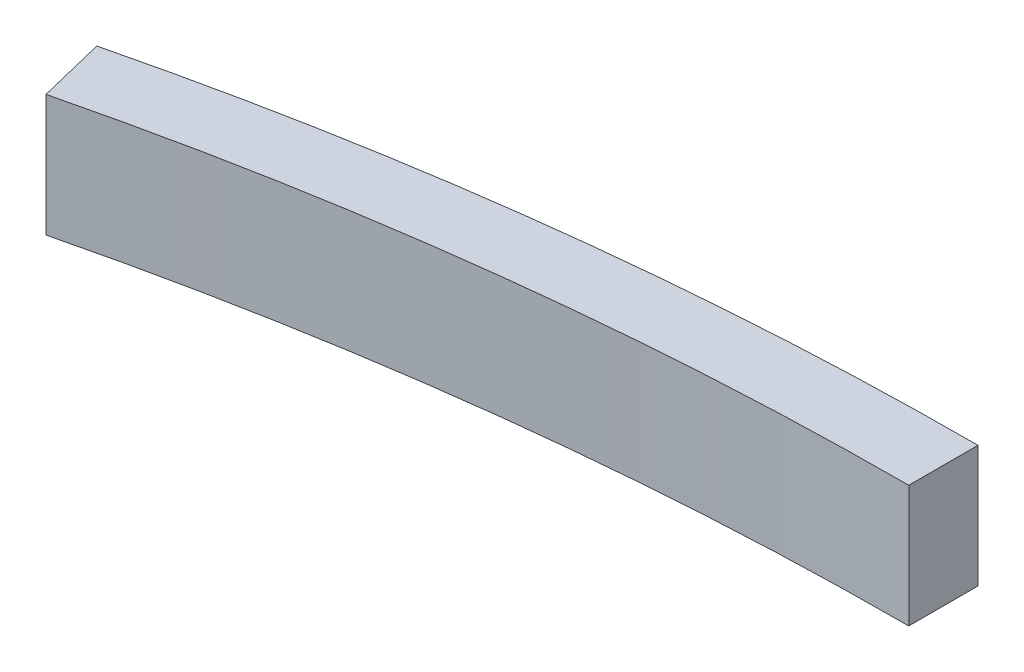
ISO-10303-21;
HEADER;
FILE_DESCRIPTION(('STEP AP214'),'2;1');
FILE_NAME('part.step','',(''),(''),'','','');
FILE_SCHEMA(('AUTOMOTIVE_DESIGN { 1 0 10303 214 1 1 1 1 }'));
ENDSEC;
DATA;
#1=APPLICATION_CONTEXT('core data for automotive mechanical design processes');
#2=APPLICATION_PROTOCOL_DEFINITION('international standard','automotive_design',2000,#1);
#3=PRODUCT_CONTEXT('',#1,'mechanical');
#4=PRODUCT('Part','Part','',(#3));
#5=PRODUCT_RELATED_PRODUCT_CATEGORY('part','',(#4));
#6=PRODUCT_DEFINITION_FORMATION('','',#4);
#7=PRODUCT_DEFINITION_CONTEXT('part definition',#1,'design');
#8=PRODUCT_DEFINITION('design','',#6,#7);
#9=PRODUCT_DEFINITION_SHAPE('','',#8);
#10=(LENGTH_UNIT() NAMED_UNIT(*) SI_UNIT(.MILLI.,.METRE.));
#11=(NAMED_UNIT(*) PLANE_ANGLE_UNIT() SI_UNIT($,.RADIAN.));
#12=(NAMED_UNIT(*) SI_UNIT($,.STERADIAN.) SOLID_ANGLE_UNIT());
#13=UNCERTAINTY_MEASURE_WITH_UNIT(LENGTH_MEASURE(1.E-05),#10,'distance_accuracy_value','');
#14=(GEOMETRIC_REPRESENTATION_CONTEXT(3) GLOBAL_UNCERTAINTY_ASSIGNED_CONTEXT((#13)) GLOBAL_UNIT_ASSIGNED_CONTEXT((#10,
#11,#12)) REPRESENTATION_CONTEXT('',''));
#15=CARTESIAN_POINT('',(0.,0.,0.));
#16=DIRECTION('',(0.,0.,1.));
#17=DIRECTION('',(1.,0.,0.));
#18=AXIS2_PLACEMENT_3D('',#15,#16,#17);
#19=CARTESIAN_POINT('',(0.,2.794,0.));
#20=DIRECTION('',(0.,-1.,0.));
#21=DIRECTION('',(0.,0.,-1.));
#22=AXIS2_PLACEMENT_3D('',#19,#20,#21);
#23=CYLINDRICAL_SURFACE('',#22,74.2442);
#24=CARTESIAN_POINT('',(0.,0.,0.));
#25=DIRECTION('',(0.,-1.,0.));
#26=DIRECTION('',(0.,0.,1.));
#27=AXIS2_PLACEMENT_3D('',#24,#25,#26);
#28=CIRCLE('',#27,74.2442);
#29=CARTESIAN_POINT('',(-17.6520779683267,0.,-72.1152229216558));
#30=VERTEX_POINT('',#29);
#31=CARTESIAN_POINT('',(0.,0.,-74.2442));
#32=VERTEX_POINT('',#31);
#33=EDGE_CURVE('E96',#30,#32,#28,.T.);
#34=ORIENTED_EDGE('',*,*,#33,.T.);
#35=DIRECTION('',(0.,-1.,0.));
#36=VECTOR('',#35,1.);
#37=CARTESIAN_POINT('',(0.,2.794,-74.2442));
#38=LINE('',#37,#36);
#39=CARTESIAN_POINT('',(0.,2.794,-74.2442));
#40=VERTEX_POINT('',#39);
#41=EDGE_CURVE('E11',#40,#32,#38,.T.);
#42=ORIENTED_EDGE('',*,*,#41,.F.);
#43=CARTESIAN_POINT('',(0.,2.794,0.));
#44=DIRECTION('',(0.,-1.,0.));
#45=DIRECTION('',(0.,0.,1.));
#46=AXIS2_PLACEMENT_3D('',#43,#44,#45);
#47=CIRCLE('',#46,74.2442);
#48=CARTESIAN_POINT('',(-17.6520779683267,2.794,-72.1152229216558));
#49=VERTEX_POINT('',#48);
#50=EDGE_CURVE('E84',#49,#40,#47,.T.);
#51=ORIENTED_EDGE('',*,*,#50,.F.);
#52=DIRECTION('',(0.,-1.,0.));
#53=VECTOR('',#52,1.);
#54=CARTESIAN_POINT('',(-17.6520779683267,2.794,-72.1152229216558));
#55=LINE('',#54,#53);
#56=EDGE_CURVE('E92',#49,#30,#55,.T.);
#57=ORIENTED_EDGE('',*,*,#56,.T.);
#58=EDGE_LOOP('',(#34,#42,#51,#57));
#59=FACE_BOUND('',#58,.T.);
#60=ADVANCED_FACE('F33',(#59),#23,.F.);
#61=CARTESIAN_POINT('',(0.,2.794,-75.8317));
#62=DIRECTION('',(-1.,0.,0.));
#63=DIRECTION('',(0.,0.,1.));
#64=AXIS2_PLACEMENT_3D('',#61,#62,#63);
#65=PLANE('',#64);
#66=DIRECTION('',(0.,0.,-1.));
#67=VECTOR('',#66,1.);
#68=CARTESIAN_POINT('',(0.,0.,-75.8317));
#69=LINE('',#68,#67);
#70=CARTESIAN_POINT('',(0.,0.,-75.8317));
#71=VERTEX_POINT('',#70);
#72=EDGE_CURVE('E88',#32,#71,#69,.T.);
#73=ORIENTED_EDGE('',*,*,#72,.T.);
#74=DIRECTION('',(0.,-1.,0.));
#75=VECTOR('',#74,1.);
#76=CARTESIAN_POINT('',(0.,2.794,-75.8317));
#77=LINE('',#76,#75);
#78=CARTESIAN_POINT('',(0.,2.794,-75.8317));
#79=VERTEX_POINT('',#78);
#80=EDGE_CURVE('E41',#79,#71,#77,.T.);
#81=ORIENTED_EDGE('',*,*,#80,.F.);
#82=DIRECTION('',(0.,0.,-1.));
#83=VECTOR('',#82,1.);
#84=CARTESIAN_POINT('',(0.,2.794,-75.8317));
#85=LINE('',#84,#83);
#86=EDGE_CURVE('E79',#40,#79,#85,.T.);
#87=ORIENTED_EDGE('',*,*,#86,.F.);
#88=ORIENTED_EDGE('',*,*,#41,.T.);
#89=EDGE_LOOP('',(#73,#81,#87,#88));
#90=FACE_BOUND('',#89,.T.);
#91=ADVANCED_FACE('F87',(#90),#65,.F.);
#92=CARTESIAN_POINT('',(0.,2.794,0.));
#93=DIRECTION('',(0.,-1.,0.));
#94=DIRECTION('',(0.,0.,-1.));
#95=AXIS2_PLACEMENT_3D('',#92,#93,#94);
#96=CYLINDRICAL_SURFACE('',#95,75.8317);
#97=CARTESIAN_POINT('',(0.,0.,0.));
#98=DIRECTION('',(0.,1.,0.));
#99=DIRECTION('',(0.,0.,1.));
#100=AXIS2_PLACEMENT_3D('',#97,#98,#99);
#101=CIRCLE('',#100,75.8317);
#102=CARTESIAN_POINT('',(-18.0295171996029,0.,-73.6572008322283));
#103=VERTEX_POINT('',#102);
#104=EDGE_CURVE('E66',#71,#103,#101,.T.);
#105=ORIENTED_EDGE('',*,*,#104,.T.);
#106=DIRECTION('',(0.,-1.,0.));
#107=VECTOR('',#106,1.);
#108=CARTESIAN_POINT('',(-18.0295171996029,2.794,-73.6572008322283));
#109=LINE('',#108,#107);
#110=CARTESIAN_POINT('',(-18.0295171996029,2.794,-73.6572008322283));
#111=VERTEX_POINT('',#110);
#112=EDGE_CURVE('E89',#111,#103,#109,.T.);
#113=ORIENTED_EDGE('',*,*,#112,.F.);
#114=CARTESIAN_POINT('',(0.,2.794,0.));
#115=DIRECTION('',(0.,1.,0.));
#116=DIRECTION('',(0.,0.,1.));
#117=AXIS2_PLACEMENT_3D('',#114,#115,#116);
#118=CIRCLE('',#117,75.8317);
#119=EDGE_CURVE('E82',#79,#111,#118,.T.);
#120=ORIENTED_EDGE('',*,*,#119,.F.);
#121=ORIENTED_EDGE('',*,*,#80,.T.);
#122=EDGE_LOOP('',(#105,#113,#120,#121));
#123=FACE_BOUND('',#122,.T.);
#124=ADVANCED_FACE('F90',(#123),#96,.T.);
#125=CARTESIAN_POINT('',(-18.0295171996029,2.794,-73.6572008322283));
#126=DIRECTION('',(0.971324668077182,0.,-0.237756996079512));
#127=DIRECTION('',(-0.237756996079512,0.,-0.971324668077182));
#128=AXIS2_PLACEMENT_3D('',#125,#126,#127);
#129=PLANE('',#128);
#130=DIRECTION('',(0.237756996079512,0.,0.971324668077182));
#131=VECTOR('',#130,1.);
#132=CARTESIAN_POINT('',(-18.0295171996029,0.,-73.6572008322283));
#133=LINE('',#132,#131);
#134=EDGE_CURVE('E72',#103,#30,#133,.T.);
#135=ORIENTED_EDGE('',*,*,#134,.T.);
#136=ORIENTED_EDGE('',*,*,#56,.F.);
#137=DIRECTION('',(0.237756996079512,0.,0.971324668077182));
#138=VECTOR('',#137,1.);
#139=CARTESIAN_POINT('',(-18.0295171996029,2.794,-73.6572008322283));
#140=LINE('',#139,#138);
#141=EDGE_CURVE('E49',#111,#49,#140,.T.);
#142=ORIENTED_EDGE('',*,*,#141,.F.);
#143=ORIENTED_EDGE('',*,*,#112,.T.);
#144=EDGE_LOOP('',(#135,#136,#142,#143));
#145=FACE_BOUND('',#144,.T.);
#146=ADVANCED_FACE('F103',(#145),#129,.F.);
#147=CARTESIAN_POINT('',(0.,2.794,0.));
#148=DIRECTION('',(0.,1.,0.));
#149=DIRECTION('',(0.,0.,1.));
#150=AXIS2_PLACEMENT_3D('',#147,#148,#149);
#151=PLANE('',#150);
#152=ORIENTED_EDGE('',*,*,#50,.T.);
#153=ORIENTED_EDGE('',*,*,#86,.T.);
#154=ORIENTED_EDGE('',*,*,#119,.T.);
#155=ORIENTED_EDGE('',*,*,#141,.T.);
#156=EDGE_LOOP('',(#152,#153,#154,#155));
#157=FACE_BOUND('',#156,.T.);
#158=ADVANCED_FACE('F80',(#157),#151,.T.);
#159=CARTESIAN_POINT('',(0.,0.,0.));
#160=DIRECTION('',(0.,1.,0.));
#161=DIRECTION('',(0.,0.,1.));
#162=AXIS2_PLACEMENT_3D('',#159,#160,#161);
#163=PLANE('',#162);
#164=ORIENTED_EDGE('',*,*,#33,.F.);
#165=ORIENTED_EDGE('',*,*,#134,.F.);
#166=ORIENTED_EDGE('',*,*,#104,.F.);
#167=ORIENTED_EDGE('',*,*,#72,.F.);
#168=EDGE_LOOP('',(#164,#165,#166,#167));
#169=FACE_BOUND('',#168,.T.);
#170=ADVANCED_FACE('F106',(#169),#163,.F.);
#171=CLOSED_SHELL('',(#60,#91,#124,#146,#158,#170));
#172=MANIFOLD_SOLID_BREP('B2',#171);
#173=ADVANCED_BREP_SHAPE_REPRESENTATION('',(#18,#172),#14);
#174=SHAPE_DEFINITION_REPRESENTATION(#9,#173);
ENDSEC;
END-ISO-10303-21;
